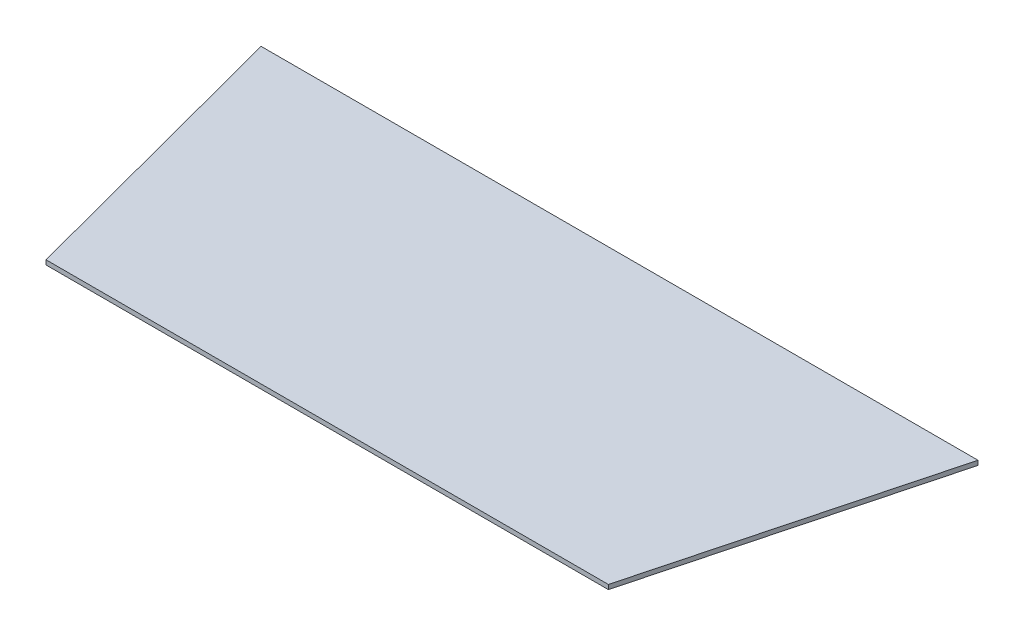
ISO-10303-21;
HEADER;
FILE_DESCRIPTION(('STEP AP214'),'2;1');
FILE_NAME('part.step','',(''),(''),'','','');
FILE_SCHEMA(('AUTOMOTIVE_DESIGN { 1 0 10303 214 1 1 1 1 }'));
ENDSEC;
DATA;
#1=APPLICATION_CONTEXT('core data for automotive mechanical design processes');
#2=APPLICATION_PROTOCOL_DEFINITION('international standard','automotive_design',2000,#1);
#3=PRODUCT_CONTEXT('',#1,'mechanical');
#4=PRODUCT('Part','Part','',(#3));
#5=PRODUCT_RELATED_PRODUCT_CATEGORY('part','',(#4));
#6=PRODUCT_DEFINITION_FORMATION('','',#4);
#7=PRODUCT_DEFINITION_CONTEXT('part definition',#1,'design');
#8=PRODUCT_DEFINITION('design','',#6,#7);
#9=PRODUCT_DEFINITION_SHAPE('','',#8);
#10=(LENGTH_UNIT() NAMED_UNIT(*) SI_UNIT(.MILLI.,.METRE.));
#11=(NAMED_UNIT(*) PLANE_ANGLE_UNIT() SI_UNIT($,.RADIAN.));
#12=(NAMED_UNIT(*) SI_UNIT($,.STERADIAN.) SOLID_ANGLE_UNIT());
#13=UNCERTAINTY_MEASURE_WITH_UNIT(LENGTH_MEASURE(1.E-05),#10,'distance_accuracy_value','');
#14=(GEOMETRIC_REPRESENTATION_CONTEXT(3) GLOBAL_UNCERTAINTY_ASSIGNED_CONTEXT((#13)) GLOBAL_UNIT_ASSIGNED_CONTEXT((#10,
#11,#12)) REPRESENTATION_CONTEXT('',''));
#15=CARTESIAN_POINT('',(0.,0.,0.));
#16=DIRECTION('',(0.,0.,1.));
#17=DIRECTION('',(1.,0.,0.));
#18=AXIS2_PLACEMENT_3D('',#15,#16,#17);
#19=CARTESIAN_POINT('',(1659.50025709551,9.99999999999968,-649.89626525331));
#20=DIRECTION('',(-0.966823388604457,0.,-0.255445757935794));
#21=DIRECTION('',(-0.255445757935793,0.,0.966823388604457));
#22=AXIS2_PLACEMENT_3D('',#19,#20,#21);
#23=PLANE('',#22);
#24=DIRECTION('',(0.255445757935793,0.,-0.966823388604457));
#25=VECTOR('',#24,1.);
#26=CARTESIAN_POINT('',(1659.50025709551,-3.33066907387547E-13,-649.896265253311));
#27=LINE('',#26,#25);
#28=CARTESIAN_POINT('',(1487.79025709551,-5.55111512312578E-13,-8.88178419700125E-13));
#29=VERTEX_POINT('',#28);
#30=CARTESIAN_POINT('',(1659.50025709551,-3.33066907387547E-13,-649.896265253311));
#31=VERTEX_POINT('',#30);
#32=EDGE_CURVE('E80',#29,#31,#27,.T.);
#33=ORIENTED_EDGE('',*,*,#32,.T.);
#34=DIRECTION('',(0.,-1.,0.));
#35=VECTOR('',#34,1.);
#36=CARTESIAN_POINT('',(1659.50025709551,9.99999999999968,-649.89626525331));
#37=LINE('',#36,#35);
#38=CARTESIAN_POINT('',(1659.50025709551,9.99999999999968,-649.89626525331));
#39=VERTEX_POINT('',#38);
#40=EDGE_CURVE('E11',#39,#31,#37,.T.);
#41=ORIENTED_EDGE('',*,*,#40,.F.);
#42=DIRECTION('',(0.255445757935793,0.,-0.966823388604457));
#43=VECTOR('',#42,1.);
#44=CARTESIAN_POINT('',(1659.50025709551,9.99999999999968,-649.89626525331));
#45=LINE('',#44,#43);
#46=CARTESIAN_POINT('',(1487.79025709551,9.99999999999934,-1.77635683940025E-12));
#47=VERTEX_POINT('',#46);
#48=EDGE_CURVE('E98',#47,#39,#45,.T.);
#49=ORIENTED_EDGE('',*,*,#48,.F.);
#50=DIRECTION('',(0.,-1.,0.));
#51=VECTOR('',#50,1.);
#52=CARTESIAN_POINT('',(1487.79025709551,9.99999999999934,-1.77635683940025E-12));
#53=LINE('',#52,#51);
#54=EDGE_CURVE('E92',#47,#29,#53,.T.);
#55=ORIENTED_EDGE('',*,*,#54,.T.);
#56=EDGE_LOOP('',(#33,#41,#49,#55));
#57=FACE_BOUND('',#56,.T.);
#58=ADVANCED_FACE('F36',(#57),#23,.F.);
#59=CARTESIAN_POINT('',(66.0802570955141,10.,-649.89626525331));
#60=DIRECTION('',(0.,0.,0.999999999999998));
#61=DIRECTION('',(0.999999999999998,0.,0.));
#62=AXIS2_PLACEMENT_3D('',#59,#60,#61);
#63=PLANE('',#62);
#64=DIRECTION('',(-0.999999999999998,0.,0.));
#65=VECTOR('',#64,1.);
#66=CARTESIAN_POINT('',(66.0802570955141,-4.44089209850063E-13,-649.896265253311));
#67=LINE('',#66,#65);
#68=CARTESIAN_POINT('',(66.0802570955141,-4.44089209850063E-13,-649.896265253311));
#69=VERTEX_POINT('',#68);
#70=EDGE_CURVE('E76',#31,#69,#67,.T.);
#71=ORIENTED_EDGE('',*,*,#70,.T.);
#72=DIRECTION('',(0.,-1.,0.));
#73=VECTOR('',#72,1.);
#74=CARTESIAN_POINT('',(66.0802570955141,10.,-649.89626525331));
#75=LINE('',#74,#73);
#76=CARTESIAN_POINT('',(66.0802570955141,10.,-649.89626525331));
#77=VERTEX_POINT('',#76);
#78=EDGE_CURVE('E43',#77,#69,#75,.T.);
#79=ORIENTED_EDGE('',*,*,#78,.F.);
#80=DIRECTION('',(-0.999999999999998,0.,0.));
#81=VECTOR('',#80,1.);
#82=CARTESIAN_POINT('',(66.0802570955141,10.,-649.89626525331));
#83=LINE('',#82,#81);
#84=EDGE_CURVE('E88',#39,#77,#83,.T.);
#85=ORIENTED_EDGE('',*,*,#84,.F.);
#86=ORIENTED_EDGE('',*,*,#40,.T.);
#87=EDGE_LOOP('',(#71,#79,#85,#86));
#88=FACE_BOUND('',#87,.T.);
#89=ADVANCED_FACE('F87',(#88),#63,.F.);
#90=CARTESIAN_POINT('',(66.0802570955141,10.,-649.89626525331));
#91=DIRECTION('',(0.966823388604458,0.,-0.255445757935787));
#92=DIRECTION('',(-0.255445757935787,0.,-0.966823388604459));
#93=AXIS2_PLACEMENT_3D('',#90,#91,#92);
#94=PLANE('',#93);
#95=DIRECTION('',(0.255445757935787,0.,0.966823388604459));
#96=VECTOR('',#95,1.);
#97=CARTESIAN_POINT('',(66.0802570955141,-4.44089209850063E-13,-649.896265253311));
#98=LINE('',#97,#96);
#99=CARTESIAN_POINT('',(237.790257095512,-2.22044604925031E-13,-1.33226762955019E-12));
#100=VERTEX_POINT('',#99);
#101=EDGE_CURVE('E81',#69,#100,#98,.T.);
#102=ORIENTED_EDGE('',*,*,#101,.T.);
#103=DIRECTION('',(0.,-1.,0.));
#104=VECTOR('',#103,1.);
#105=CARTESIAN_POINT('',(237.790257095512,9.99999999999979,-1.33226762955019E-12));
#106=LINE('',#105,#104);
#107=CARTESIAN_POINT('',(237.790257095512,9.99999999999979,-1.33226762955019E-12));
#108=VERTEX_POINT('',#107);
#109=EDGE_CURVE('E104',#108,#100,#106,.T.);
#110=ORIENTED_EDGE('',*,*,#109,.F.);
#111=DIRECTION('',(0.255445757935787,0.,0.966823388604459));
#112=VECTOR('',#111,1.);
#113=CARTESIAN_POINT('',(66.0802570955141,10.,-649.89626525331));
#114=LINE('',#113,#112);
#115=EDGE_CURVE('E55',#77,#108,#114,.T.);
#116=ORIENTED_EDGE('',*,*,#115,.F.);
#117=ORIENTED_EDGE('',*,*,#78,.T.);
#118=EDGE_LOOP('',(#102,#110,#116,#117));
#119=FACE_BOUND('',#118,.T.);
#120=ADVANCED_FACE('F107',(#119),#94,.F.);
#121=CARTESIAN_POINT('',(237.790257095512,9.99999999999979,-1.33226762955019E-12));
#122=DIRECTION('',(0.,0.,-0.999999999999998));
#123=DIRECTION('',(-0.999999999999998,0.,0.));
#124=AXIS2_PLACEMENT_3D('',#121,#122,#123);
#125=PLANE('',#124);
#126=DIRECTION('',(0.999999999999998,0.,0.));
#127=VECTOR('',#126,1.);
#128=CARTESIAN_POINT('',(237.790257095512,-2.22044604925031E-13,-1.33226762955019E-12));
#129=LINE('',#128,#127);
#130=EDGE_CURVE('E96',#100,#29,#129,.T.);
#131=ORIENTED_EDGE('',*,*,#130,.T.);
#132=ORIENTED_EDGE('',*,*,#54,.F.);
#133=DIRECTION('',(0.999999999999998,0.,0.));
#134=VECTOR('',#133,1.);
#135=CARTESIAN_POINT('',(237.790257095512,9.99999999999979,-1.33226762955019E-12));
#136=LINE('',#135,#134);
#137=EDGE_CURVE('E50',#108,#47,#136,.T.);
#138=ORIENTED_EDGE('',*,*,#137,.F.);
#139=ORIENTED_EDGE('',*,*,#109,.T.);
#140=EDGE_LOOP('',(#131,#132,#138,#139));
#141=FACE_BOUND('',#140,.T.);
#142=ADVANCED_FACE('F109',(#141),#125,.F.);
#143=CARTESIAN_POINT('',(1487.79025709551,9.99999999999934,-1.77635683940025E-12));
#144=DIRECTION('',(0.,0.999999999999999,0.));
#145=DIRECTION('',(0.,0.,0.999999999999998));
#146=AXIS2_PLACEMENT_3D('',#143,#144,#145);
#147=PLANE('',#146);
#148=ORIENTED_EDGE('',*,*,#48,.T.);
#149=ORIENTED_EDGE('',*,*,#84,.T.);
#150=ORIENTED_EDGE('',*,*,#115,.T.);
#151=ORIENTED_EDGE('',*,*,#137,.T.);
#152=EDGE_LOOP('',(#148,#149,#150,#151));
#153=FACE_BOUND('',#152,.T.);
#154=ADVANCED_FACE('F110',(#153),#147,.T.);
#155=CARTESIAN_POINT('',(1487.79025709551,-5.55111512312578E-13,-8.88178419700125E-13));
#156=DIRECTION('',(0.,0.999999999999999,0.));
#157=DIRECTION('',(0.,0.,0.999999999999998));
#158=AXIS2_PLACEMENT_3D('',#155,#156,#157);
#159=PLANE('',#158);
#160=ORIENTED_EDGE('',*,*,#32,.F.);
#161=ORIENTED_EDGE('',*,*,#130,.F.);
#162=ORIENTED_EDGE('',*,*,#101,.F.);
#163=ORIENTED_EDGE('',*,*,#70,.F.);
#164=EDGE_LOOP('',(#160,#161,#162,#163));
#165=FACE_BOUND('',#164,.T.);
#166=ADVANCED_FACE('F77',(#165),#159,.F.);
#167=CLOSED_SHELL('',(#58,#89,#120,#142,#154,#166));
#168=MANIFOLD_SOLID_BREP('B2',#167);
#169=ADVANCED_BREP_SHAPE_REPRESENTATION('',(#18,#168),#14);
#170=SHAPE_DEFINITION_REPRESENTATION(#9,#169);
ENDSEC;
END-ISO-10303-21;
